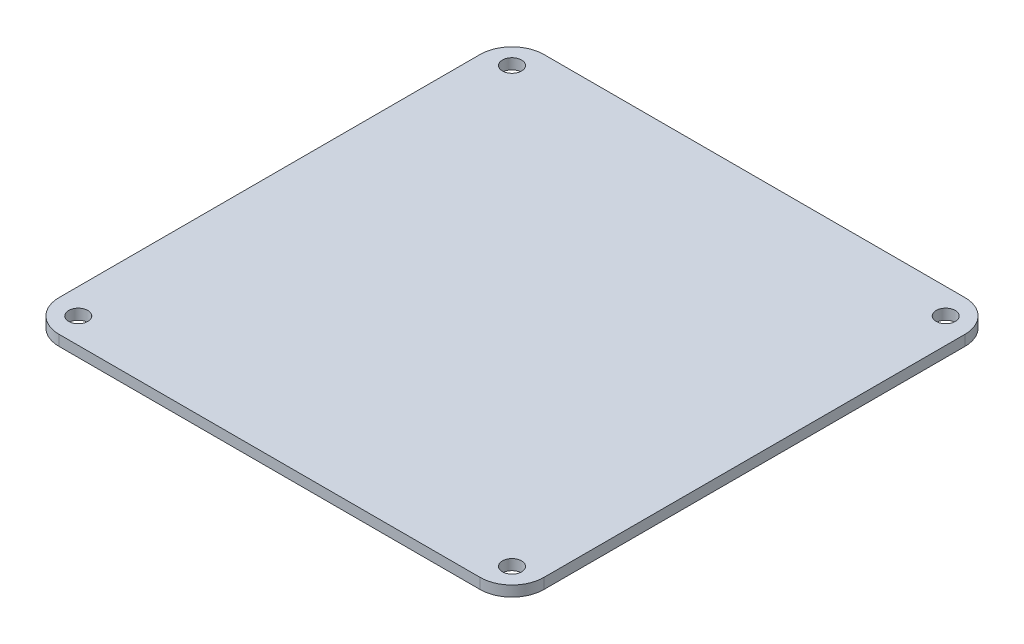
ISO-10303-21;
HEADER;
FILE_DESCRIPTION(('STEP AP214'),'2;1');
FILE_NAME('part.step','',(''),(''),'','','');
FILE_SCHEMA(('AUTOMOTIVE_DESIGN { 1 0 10303 214 1 1 1 1 }'));
ENDSEC;
DATA;
#1=APPLICATION_CONTEXT('core data for automotive mechanical design processes');
#2=APPLICATION_PROTOCOL_DEFINITION('international standard','automotive_design',2000,#1);
#3=PRODUCT_CONTEXT('',#1,'mechanical');
#4=PRODUCT('Part','Part','',(#3));
#5=PRODUCT_RELATED_PRODUCT_CATEGORY('part','',(#4));
#6=PRODUCT_DEFINITION_FORMATION('','',#4);
#7=PRODUCT_DEFINITION_CONTEXT('part definition',#1,'design');
#8=PRODUCT_DEFINITION('design','',#6,#7);
#9=PRODUCT_DEFINITION_SHAPE('','',#8);
#10=(LENGTH_UNIT() NAMED_UNIT(*) SI_UNIT(.MILLI.,.METRE.));
#11=(NAMED_UNIT(*) PLANE_ANGLE_UNIT() SI_UNIT($,.RADIAN.));
#12=(NAMED_UNIT(*) SI_UNIT($,.STERADIAN.) SOLID_ANGLE_UNIT());
#13=UNCERTAINTY_MEASURE_WITH_UNIT(LENGTH_MEASURE(1.E-05),#10,'distance_accuracy_value','');
#14=(GEOMETRIC_REPRESENTATION_CONTEXT(3) GLOBAL_UNCERTAINTY_ASSIGNED_CONTEXT((#13)) GLOBAL_UNIT_ASSIGNED_CONTEXT((#10,
#11,#12)) REPRESENTATION_CONTEXT('',''));
#15=CARTESIAN_POINT('',(0.,0.,0.));
#16=DIRECTION('',(0.,0.,1.));
#17=DIRECTION('',(1.,0.,0.));
#18=AXIS2_PLACEMENT_3D('',#15,#16,#17);
#19=CARTESIAN_POINT('',(-33.,1.65,-33.));
#20=DIRECTION('',(0.,-1.,0.));
#21=DIRECTION('',(0.,0.,-1.));
#22=AXIS2_PLACEMENT_3D('',#19,#20,#21);
#23=CYLINDRICAL_SURFACE('',#22,5.);
#24=CARTESIAN_POINT('',(-33.,0.,-33.));
#25=DIRECTION('',(0.,1.,0.));
#26=DIRECTION('',(0.,0.,1.));
#27=AXIS2_PLACEMENT_3D('',#24,#25,#26);
#28=CIRCLE('',#27,5.);
#29=CARTESIAN_POINT('',(-38.,0.,-33.));
#30=VERTEX_POINT('',#29);
#31=CARTESIAN_POINT('',(-33.,0.,-38.));
#32=VERTEX_POINT('',#31);
#33=EDGE_CURVE('E170',#30,#32,#28,.F.);
#34=ORIENTED_EDGE('',*,*,#33,.F.);
#35=DIRECTION('',(0.,-1.,0.));
#36=VECTOR('',#35,1.);
#37=CARTESIAN_POINT('',(-38.,1.65,-33.));
#38=LINE('',#37,#36);
#39=CARTESIAN_POINT('',(-38.,1.65,-33.));
#40=VERTEX_POINT('',#39);
#41=EDGE_CURVE('E11',#40,#30,#38,.T.);
#42=ORIENTED_EDGE('',*,*,#41,.F.);
#43=CARTESIAN_POINT('',(-33.,1.65,-33.));
#44=DIRECTION('',(0.,1.,0.));
#45=DIRECTION('',(0.,0.,1.));
#46=AXIS2_PLACEMENT_3D('',#43,#44,#45);
#47=CIRCLE('',#46,5.);
#48=CARTESIAN_POINT('',(-33.,1.65,-38.));
#49=VERTEX_POINT('',#48);
#50=EDGE_CURVE('E372',#40,#49,#47,.F.);
#51=ORIENTED_EDGE('',*,*,#50,.T.);
#52=DIRECTION('',(0.,-1.,0.));
#53=VECTOR('',#52,1.);
#54=CARTESIAN_POINT('',(-33.,1.65,-38.));
#55=LINE('',#54,#53);
#56=EDGE_CURVE('E65',#49,#32,#55,.T.);
#57=ORIENTED_EDGE('',*,*,#56,.T.);
#58=EDGE_LOOP('',(#34,#42,#51,#57));
#59=FACE_BOUND('',#58,.T.);
#60=ADVANCED_FACE('F47',(#59),#23,.T.);
#61=CARTESIAN_POINT('',(-38.,1.65,0.));
#62=DIRECTION('',(-1.,0.,0.));
#63=DIRECTION('',(0.,0.,1.));
#64=AXIS2_PLACEMENT_3D('',#61,#62,#63);
#65=PLANE('',#64);
#66=DIRECTION('',(0.,0.,-1.));
#67=VECTOR('',#66,1.);
#68=CARTESIAN_POINT('',(-38.,0.,0.));
#69=LINE('',#68,#67);
#70=CARTESIAN_POINT('',(-38.,0.,33.));
#71=VERTEX_POINT('',#70);
#72=EDGE_CURVE('E166',#71,#30,#69,.T.);
#73=ORIENTED_EDGE('',*,*,#72,.F.);
#74=DIRECTION('',(0.,-1.,0.));
#75=VECTOR('',#74,1.);
#76=CARTESIAN_POINT('',(-38.,1.65,33.));
#77=LINE('',#76,#75);
#78=CARTESIAN_POINT('',(-38.,1.65,33.));
#79=VERTEX_POINT('',#78);
#80=EDGE_CURVE('E57',#79,#71,#77,.T.);
#81=ORIENTED_EDGE('',*,*,#80,.F.);
#82=DIRECTION('',(0.,0.,-1.));
#83=VECTOR('',#82,1.);
#84=CARTESIAN_POINT('',(-38.,1.65,0.));
#85=LINE('',#84,#83);
#86=EDGE_CURVE('E369',#79,#40,#85,.T.);
#87=ORIENTED_EDGE('',*,*,#86,.T.);
#88=ORIENTED_EDGE('',*,*,#41,.T.);
#89=EDGE_LOOP('',(#73,#81,#87,#88));
#90=FACE_BOUND('',#89,.T.);
#91=ADVANCED_FACE('F167',(#90),#65,.T.);
#92=CARTESIAN_POINT('',(-33.,1.65,33.));
#93=DIRECTION('',(0.,-1.,0.));
#94=DIRECTION('',(0.,0.,-1.));
#95=AXIS2_PLACEMENT_3D('',#92,#93,#94);
#96=CYLINDRICAL_SURFACE('',#95,5.);
#97=CARTESIAN_POINT('',(-33.,0.,33.));
#98=DIRECTION('',(0.,1.,0.));
#99=DIRECTION('',(0.,0.,1.));
#100=AXIS2_PLACEMENT_3D('',#97,#98,#99);
#101=CIRCLE('',#100,5.);
#102=CARTESIAN_POINT('',(-33.,0.,38.));
#103=VERTEX_POINT('',#102);
#104=EDGE_CURVE('E159',#103,#71,#101,.F.);
#105=ORIENTED_EDGE('',*,*,#104,.F.);
#106=DIRECTION('',(0.,-1.,0.));
#107=VECTOR('',#106,1.);
#108=CARTESIAN_POINT('',(-33.,1.65,38.));
#109=LINE('',#108,#107);
#110=CARTESIAN_POINT('',(-33.,1.65,38.));
#111=VERTEX_POINT('',#110);
#112=EDGE_CURVE('E150',#111,#103,#109,.T.);
#113=ORIENTED_EDGE('',*,*,#112,.F.);
#114=CARTESIAN_POINT('',(-33.,1.65,33.));
#115=DIRECTION('',(0.,1.,0.));
#116=DIRECTION('',(0.,0.,1.));
#117=AXIS2_PLACEMENT_3D('',#114,#115,#116);
#118=CIRCLE('',#117,5.);
#119=EDGE_CURVE('E161',#111,#79,#118,.F.);
#120=ORIENTED_EDGE('',*,*,#119,.T.);
#121=ORIENTED_EDGE('',*,*,#80,.T.);
#122=EDGE_LOOP('',(#105,#113,#120,#121));
#123=FACE_BOUND('',#122,.T.);
#124=ADVANCED_FACE('F157',(#123),#96,.T.);
#125=CARTESIAN_POINT('',(0.,1.65,38.));
#126=DIRECTION('',(0.,0.,-1.));
#127=DIRECTION('',(-1.,0.,0.));
#128=AXIS2_PLACEMENT_3D('',#125,#126,#127);
#129=PLANE('',#128);
#130=DIRECTION('',(1.,0.,0.));
#131=VECTOR('',#130,1.);
#132=CARTESIAN_POINT('',(0.,0.,38.));
#133=LINE('',#132,#131);
#134=CARTESIAN_POINT('',(33.,0.,38.));
#135=VERTEX_POINT('',#134);
#136=EDGE_CURVE('E176',#103,#135,#133,.T.);
#137=ORIENTED_EDGE('',*,*,#136,.T.);
#138=DIRECTION('',(0.,-1.,0.));
#139=VECTOR('',#138,1.);
#140=CARTESIAN_POINT('',(33.,1.65,38.));
#141=LINE('',#140,#139);
#142=CARTESIAN_POINT('',(33.,1.65,38.));
#143=VERTEX_POINT('',#142);
#144=EDGE_CURVE('E143',#143,#135,#141,.T.);
#145=ORIENTED_EDGE('',*,*,#144,.F.);
#146=DIRECTION('',(1.,0.,0.));
#147=VECTOR('',#146,1.);
#148=CARTESIAN_POINT('',(0.,1.65,38.));
#149=LINE('',#148,#147);
#150=EDGE_CURVE('E362',#111,#143,#149,.T.);
#151=ORIENTED_EDGE('',*,*,#150,.F.);
#152=ORIENTED_EDGE('',*,*,#112,.T.);
#153=EDGE_LOOP('',(#137,#145,#151,#152));
#154=FACE_BOUND('',#153,.T.);
#155=ADVANCED_FACE('F323',(#154),#129,.F.);
#156=CARTESIAN_POINT('',(33.,1.65,33.));
#157=DIRECTION('',(0.,-1.,0.));
#158=DIRECTION('',(0.,0.,-1.));
#159=AXIS2_PLACEMENT_3D('',#156,#157,#158);
#160=CYLINDRICAL_SURFACE('',#159,5.);
#161=CARTESIAN_POINT('',(33.,0.,33.));
#162=DIRECTION('',(0.,1.,0.));
#163=DIRECTION('',(0.,0.,1.));
#164=AXIS2_PLACEMENT_3D('',#161,#162,#163);
#165=CIRCLE('',#164,5.);
#166=CARTESIAN_POINT('',(38.,0.,33.));
#167=VERTEX_POINT('',#166);
#168=EDGE_CURVE('E180',#167,#135,#165,.F.);
#169=ORIENTED_EDGE('',*,*,#168,.F.);
#170=DIRECTION('',(0.,-1.,0.));
#171=VECTOR('',#170,1.);
#172=CARTESIAN_POINT('',(38.,1.65,33.));
#173=LINE('',#172,#171);
#174=CARTESIAN_POINT('',(38.,1.65,33.));
#175=VERTEX_POINT('',#174);
#176=EDGE_CURVE('E139',#175,#167,#173,.T.);
#177=ORIENTED_EDGE('',*,*,#176,.F.);
#178=CARTESIAN_POINT('',(33.,1.65,33.));
#179=DIRECTION('',(0.,1.,0.));
#180=DIRECTION('',(0.,0.,1.));
#181=AXIS2_PLACEMENT_3D('',#178,#179,#180);
#182=CIRCLE('',#181,5.);
#183=EDGE_CURVE('E131',#175,#143,#182,.F.);
#184=ORIENTED_EDGE('',*,*,#183,.T.);
#185=ORIENTED_EDGE('',*,*,#144,.T.);
#186=EDGE_LOOP('',(#169,#177,#184,#185));
#187=FACE_BOUND('',#186,.T.);
#188=ADVANCED_FACE('F315',(#187),#160,.T.);
#189=CARTESIAN_POINT('',(38.,1.65,0.));
#190=DIRECTION('',(-1.,0.,0.));
#191=DIRECTION('',(0.,0.,1.));
#192=AXIS2_PLACEMENT_3D('',#189,#190,#191);
#193=PLANE('',#192);
#194=DIRECTION('',(0.,0.,-1.));
#195=VECTOR('',#194,1.);
#196=CARTESIAN_POINT('',(38.,0.,0.));
#197=LINE('',#196,#195);
#198=CARTESIAN_POINT('',(38.,0.,-33.));
#199=VERTEX_POINT('',#198);
#200=EDGE_CURVE('E137',#167,#199,#197,.T.);
#201=ORIENTED_EDGE('',*,*,#200,.T.);
#202=DIRECTION('',(0.,-1.,0.));
#203=VECTOR('',#202,1.);
#204=CARTESIAN_POINT('',(38.,1.65,-33.));
#205=LINE('',#204,#203);
#206=CARTESIAN_POINT('',(38.,1.65,-33.));
#207=VERTEX_POINT('',#206);
#208=EDGE_CURVE('E119',#207,#199,#205,.T.);
#209=ORIENTED_EDGE('',*,*,#208,.F.);
#210=DIRECTION('',(0.,0.,-1.));
#211=VECTOR('',#210,1.);
#212=CARTESIAN_POINT('',(38.,1.65,0.));
#213=LINE('',#212,#211);
#214=EDGE_CURVE('E125',#175,#207,#213,.T.);
#215=ORIENTED_EDGE('',*,*,#214,.F.);
#216=ORIENTED_EDGE('',*,*,#176,.T.);
#217=EDGE_LOOP('',(#201,#209,#215,#216));
#218=FACE_BOUND('',#217,.T.);
#219=ADVANCED_FACE('F135',(#218),#193,.F.);
#220=CARTESIAN_POINT('',(33.,1.65,-33.));
#221=DIRECTION('',(0.,-1.,0.));
#222=DIRECTION('',(0.,0.,-1.));
#223=AXIS2_PLACEMENT_3D('',#220,#221,#222);
#224=CYLINDRICAL_SURFACE('',#223,5.);
#225=CARTESIAN_POINT('',(33.,0.,-33.));
#226=DIRECTION('',(0.,1.,0.));
#227=DIRECTION('',(0.,0.,1.));
#228=AXIS2_PLACEMENT_3D('',#225,#226,#227);
#229=CIRCLE('',#228,5.);
#230=CARTESIAN_POINT('',(33.,0.,-38.));
#231=VERTEX_POINT('',#230);
#232=EDGE_CURVE('E188',#199,#231,#229,.T.);
#233=ORIENTED_EDGE('',*,*,#232,.T.);
#234=DIRECTION('',(0.,-1.,0.));
#235=VECTOR('',#234,1.);
#236=CARTESIAN_POINT('',(33.,1.65,-38.));
#237=LINE('',#236,#235);
#238=CARTESIAN_POINT('',(33.,1.65,-38.));
#239=VERTEX_POINT('',#238);
#240=EDGE_CURVE('E91',#239,#231,#237,.T.);
#241=ORIENTED_EDGE('',*,*,#240,.F.);
#242=CARTESIAN_POINT('',(33.,1.65,-33.));
#243=DIRECTION('',(0.,1.,0.));
#244=DIRECTION('',(0.,0.,1.));
#245=AXIS2_PLACEMENT_3D('',#242,#243,#244);
#246=CIRCLE('',#245,5.);
#247=EDGE_CURVE('E115',#207,#239,#246,.T.);
#248=ORIENTED_EDGE('',*,*,#247,.F.);
#249=ORIENTED_EDGE('',*,*,#208,.T.);
#250=EDGE_LOOP('',(#233,#241,#248,#249));
#251=FACE_BOUND('',#250,.T.);
#252=ADVANCED_FACE('F117',(#251),#224,.T.);
#253=CARTESIAN_POINT('',(-34.,1.65,-34.));
#254=DIRECTION('',(0.,-1.,0.));
#255=DIRECTION('',(0.,0.,-1.));
#256=AXIS2_PLACEMENT_3D('',#253,#254,#255);
#257=CYLINDRICAL_SURFACE('',#256,1.50000000000001);
#258=CARTESIAN_POINT('',(-34.,1.65,-34.));
#259=DIRECTION('',(0.,1.,0.));
#260=DIRECTION('',(0.,0.,1.));
#261=AXIS2_PLACEMENT_3D('',#258,#259,#260);
#262=CIRCLE('',#261,1.50000000000001);
#263=CARTESIAN_POINT('',(-34.,1.65,-32.5));
#264=VERTEX_POINT('',#263);
#265=EDGE_CURVE('E375',#264,#264,#262,.F.);
#266=ORIENTED_EDGE('',*,*,#265,.F.);
#267=EDGE_LOOP('',(#266));
#268=FACE_BOUND('',#267,.T.);
#269=CARTESIAN_POINT('',(-34.,0.,-34.));
#270=DIRECTION('',(0.,1.,0.));
#271=DIRECTION('',(0.,0.,1.));
#272=AXIS2_PLACEMENT_3D('',#269,#270,#271);
#273=CIRCLE('',#272,1.50000000000001);
#274=CARTESIAN_POINT('',(-34.,0.,-32.5));
#275=VERTEX_POINT('',#274);
#276=EDGE_CURVE('E211',#275,#275,#273,.F.);
#277=ORIENTED_EDGE('',*,*,#276,.T.);
#278=EDGE_LOOP('',(#277));
#279=FACE_BOUND('',#278,.T.);
#280=ADVANCED_FACE('F236',(#268,#279),#257,.F.);
#281=CARTESIAN_POINT('',(-34.,1.65,34.));
#282=DIRECTION('',(0.,-1.,0.));
#283=DIRECTION('',(0.,0.,-1.));
#284=AXIS2_PLACEMENT_3D('',#281,#282,#283);
#285=CYLINDRICAL_SURFACE('',#284,1.5);
#286=CARTESIAN_POINT('',(-34.,1.65,34.));
#287=DIRECTION('',(0.,1.,0.));
#288=DIRECTION('',(0.,0.,1.));
#289=AXIS2_PLACEMENT_3D('',#286,#287,#288);
#290=CIRCLE('',#289,1.5);
#291=CARTESIAN_POINT('',(-34.,1.65,35.5));
#292=VERTEX_POINT('',#291);
#293=EDGE_CURVE('E379',#292,#292,#290,.T.);
#294=ORIENTED_EDGE('',*,*,#293,.T.);
#295=EDGE_LOOP('',(#294));
#296=FACE_BOUND('',#295,.T.);
#297=CARTESIAN_POINT('',(-34.,0.,34.));
#298=DIRECTION('',(0.,1.,0.));
#299=DIRECTION('',(0.,0.,1.));
#300=AXIS2_PLACEMENT_3D('',#297,#298,#299);
#301=CIRCLE('',#300,1.5);
#302=CARTESIAN_POINT('',(-34.,0.,35.5));
#303=VERTEX_POINT('',#302);
#304=EDGE_CURVE('E207',#303,#303,#301,.T.);
#305=ORIENTED_EDGE('',*,*,#304,.F.);
#306=EDGE_LOOP('',(#305));
#307=FACE_BOUND('',#306,.T.);
#308=ADVANCED_FACE('F239',(#296,#307),#285,.F.);
#309=CARTESIAN_POINT('',(34.,1.65,-34.));
#310=DIRECTION('',(0.,-1.,0.));
#311=DIRECTION('',(0.,0.,-1.));
#312=AXIS2_PLACEMENT_3D('',#309,#310,#311);
#313=CYLINDRICAL_SURFACE('',#312,1.5);
#314=CARTESIAN_POINT('',(34.,1.65,-34.));
#315=DIRECTION('',(0.,1.,0.));
#316=DIRECTION('',(0.,0.,1.));
#317=AXIS2_PLACEMENT_3D('',#314,#315,#316);
#318=CIRCLE('',#317,1.5);
#319=CARTESIAN_POINT('',(34.,1.65,-32.5));
#320=VERTEX_POINT('',#319);
#321=EDGE_CURVE('E250',#320,#320,#318,.T.);
#322=ORIENTED_EDGE('',*,*,#321,.T.);
#323=EDGE_LOOP('',(#322));
#324=FACE_BOUND('',#323,.T.);
#325=CARTESIAN_POINT('',(34.,0.,-34.));
#326=DIRECTION('',(0.,1.,0.));
#327=DIRECTION('',(0.,0.,1.));
#328=AXIS2_PLACEMENT_3D('',#325,#326,#327);
#329=CIRCLE('',#328,1.5);
#330=CARTESIAN_POINT('',(34.,0.,-32.5));
#331=VERTEX_POINT('',#330);
#332=EDGE_CURVE('E203',#331,#331,#329,.T.);
#333=ORIENTED_EDGE('',*,*,#332,.F.);
#334=EDGE_LOOP('',(#333));
#335=FACE_BOUND('',#334,.T.);
#336=ADVANCED_FACE('F224',(#324,#335),#313,.F.);
#337=CARTESIAN_POINT('',(34.,1.65,34.));
#338=DIRECTION('',(0.,-1.,0.));
#339=DIRECTION('',(0.,0.,-1.));
#340=AXIS2_PLACEMENT_3D('',#337,#338,#339);
#341=CYLINDRICAL_SURFACE('',#340,1.50000000000002);
#342=CARTESIAN_POINT('',(34.,1.65,34.));
#343=DIRECTION('',(0.,1.,0.));
#344=DIRECTION('',(0.,0.,1.));
#345=AXIS2_PLACEMENT_3D('',#342,#343,#344);
#346=CIRCLE('',#345,1.50000000000002);
#347=CARTESIAN_POINT('',(34.,1.65,35.5));
#348=VERTEX_POINT('',#347);
#349=EDGE_CURVE('E194',#348,#348,#346,.F.);
#350=ORIENTED_EDGE('',*,*,#349,.F.);
#351=EDGE_LOOP('',(#350));
#352=FACE_BOUND('',#351,.T.);
#353=CARTESIAN_POINT('',(34.,0.,34.));
#354=DIRECTION('',(0.,1.,0.));
#355=DIRECTION('',(0.,0.,1.));
#356=AXIS2_PLACEMENT_3D('',#353,#354,#355);
#357=CIRCLE('',#356,1.50000000000002);
#358=CARTESIAN_POINT('',(34.,0.,35.5));
#359=VERTEX_POINT('',#358);
#360=EDGE_CURVE('E199',#359,#359,#357,.F.);
#361=ORIENTED_EDGE('',*,*,#360,.T.);
#362=EDGE_LOOP('',(#361));
#363=FACE_BOUND('',#362,.T.);
#364=ADVANCED_FACE('F49',(#352,#363),#341,.F.);
#365=CARTESIAN_POINT('',(0.,1.65,-38.));
#366=DIRECTION('',(0.,0.,-1.));
#367=DIRECTION('',(-1.,0.,0.));
#368=AXIS2_PLACEMENT_3D('',#365,#366,#367);
#369=PLANE('',#368);
#370=DIRECTION('',(1.,0.,0.));
#371=VECTOR('',#370,1.);
#372=CARTESIAN_POINT('',(0.,0.,-38.));
#373=LINE('',#372,#371);
#374=EDGE_CURVE('E191',#32,#231,#373,.T.);
#375=ORIENTED_EDGE('',*,*,#374,.F.);
#376=ORIENTED_EDGE('',*,*,#56,.F.);
#377=DIRECTION('',(1.,0.,0.));
#378=VECTOR('',#377,1.);
#379=CARTESIAN_POINT('',(0.,1.65,-38.));
#380=LINE('',#379,#378);
#381=EDGE_CURVE('E124',#49,#239,#380,.T.);
#382=ORIENTED_EDGE('',*,*,#381,.T.);
#383=ORIENTED_EDGE('',*,*,#240,.T.);
#384=EDGE_LOOP('',(#375,#376,#382,#383));
#385=FACE_BOUND('',#384,.T.);
#386=ADVANCED_FACE('F215',(#385),#369,.T.);
#387=CARTESIAN_POINT('',(0.,1.65,0.));
#388=DIRECTION('',(0.,1.,0.));
#389=DIRECTION('',(0.,0.,1.));
#390=AXIS2_PLACEMENT_3D('',#387,#388,#389);
#391=PLANE('',#390);
#392=ORIENTED_EDGE('',*,*,#349,.T.);
#393=EDGE_LOOP('',(#392));
#394=FACE_BOUND('',#393,.T.);
#395=ORIENTED_EDGE('',*,*,#321,.F.);
#396=EDGE_LOOP('',(#395));
#397=FACE_BOUND('',#396,.T.);
#398=ORIENTED_EDGE('',*,*,#293,.F.);
#399=EDGE_LOOP('',(#398));
#400=FACE_BOUND('',#399,.T.);
#401=ORIENTED_EDGE('',*,*,#265,.T.);
#402=EDGE_LOOP('',(#401));
#403=FACE_BOUND('',#402,.T.);
#404=ORIENTED_EDGE('',*,*,#50,.F.);
#405=ORIENTED_EDGE('',*,*,#86,.F.);
#406=ORIENTED_EDGE('',*,*,#119,.F.);
#407=ORIENTED_EDGE('',*,*,#150,.T.);
#408=ORIENTED_EDGE('',*,*,#183,.F.);
#409=ORIENTED_EDGE('',*,*,#214,.T.);
#410=ORIENTED_EDGE('',*,*,#247,.T.);
#411=ORIENTED_EDGE('',*,*,#381,.F.);
#412=EDGE_LOOP('',(#404,#405,#406,#407,#408,#409,#410,#411));
#413=FACE_BOUND('',#412,.T.);
#414=ADVANCED_FACE('F129',(#394,#397,#400,#403,#413),#391,.T.);
#415=CARTESIAN_POINT('',(0.,0.,0.));
#416=DIRECTION('',(0.,1.,0.));
#417=DIRECTION('',(0.,0.,1.));
#418=AXIS2_PLACEMENT_3D('',#415,#416,#417);
#419=PLANE('',#418);
#420=ORIENTED_EDGE('',*,*,#360,.F.);
#421=EDGE_LOOP('',(#420));
#422=FACE_BOUND('',#421,.T.);
#423=ORIENTED_EDGE('',*,*,#332,.T.);
#424=EDGE_LOOP('',(#423));
#425=FACE_BOUND('',#424,.T.);
#426=ORIENTED_EDGE('',*,*,#304,.T.);
#427=EDGE_LOOP('',(#426));
#428=FACE_BOUND('',#427,.T.);
#429=ORIENTED_EDGE('',*,*,#276,.F.);
#430=EDGE_LOOP('',(#429));
#431=FACE_BOUND('',#430,.T.);
#432=ORIENTED_EDGE('',*,*,#33,.T.);
#433=ORIENTED_EDGE('',*,*,#374,.T.);
#434=ORIENTED_EDGE('',*,*,#232,.F.);
#435=ORIENTED_EDGE('',*,*,#200,.F.);
#436=ORIENTED_EDGE('',*,*,#168,.T.);
#437=ORIENTED_EDGE('',*,*,#136,.F.);
#438=ORIENTED_EDGE('',*,*,#104,.T.);
#439=ORIENTED_EDGE('',*,*,#72,.T.);
#440=EDGE_LOOP('',(#432,#433,#434,#435,#436,#437,#438,#439));
#441=FACE_BOUND('',#440,.T.);
#442=ADVANCED_FACE('F173',(#422,#425,#428,#431,#441),#419,.F.);
#443=CLOSED_SHELL('',(#60,#91,#124,#155,#188,#219,#252,#280,#308,#336,#364,#386,#414,#442));
#444=MANIFOLD_SOLID_BREP('B2',#443);
#445=ADVANCED_BREP_SHAPE_REPRESENTATION('',(#18,#444),#14);
#446=SHAPE_DEFINITION_REPRESENTATION(#9,#445);
ENDSEC;
END-ISO-10303-21;
